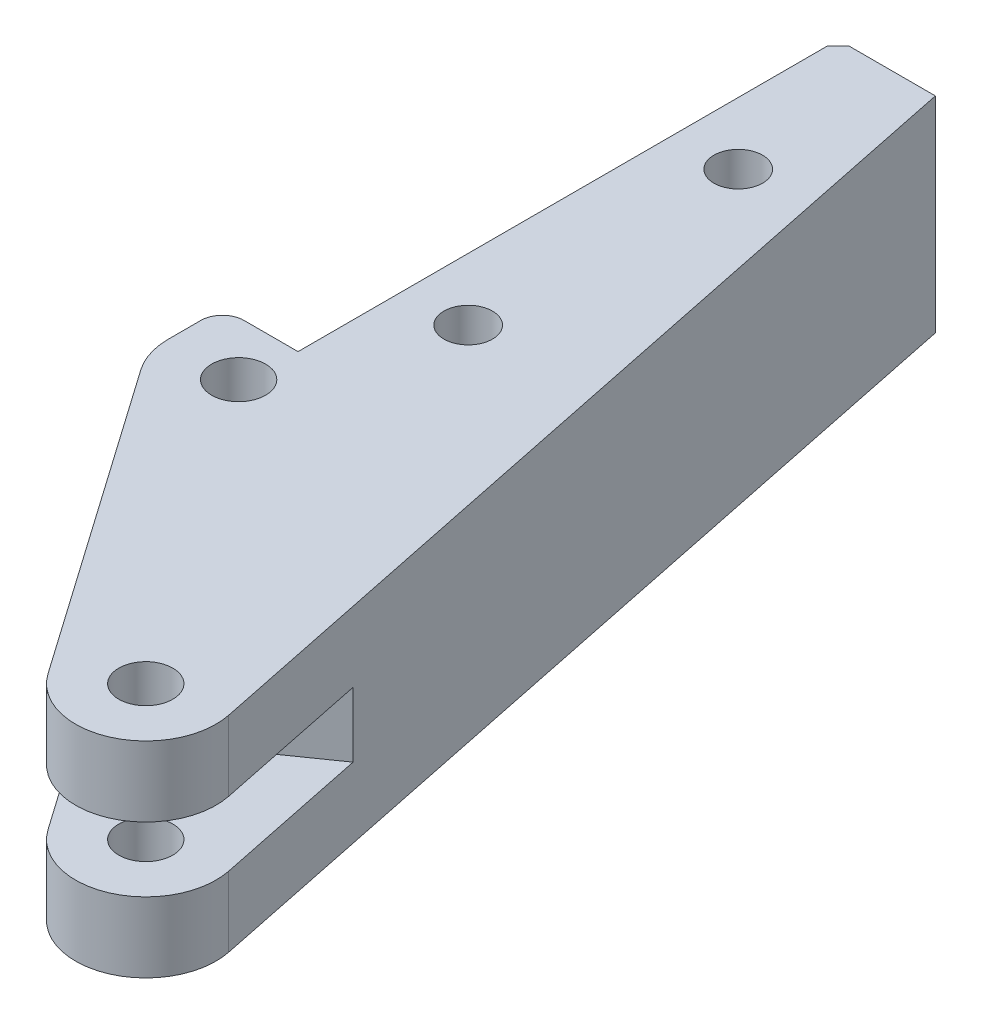
ISO-10303-21;
HEADER;
FILE_DESCRIPTION(('STEP AP214'),'2;1');
FILE_NAME('part.step','',(''),(''),'','','');
FILE_SCHEMA(('AUTOMOTIVE_DESIGN { 1 0 10303 214 1 1 1 1 }'));
ENDSEC;
DATA;
#1=APPLICATION_CONTEXT('core data for automotive mechanical design processes');
#2=APPLICATION_PROTOCOL_DEFINITION('international standard','automotive_design',2000,#1);
#3=PRODUCT_CONTEXT('',#1,'mechanical');
#4=PRODUCT('Part','Part','',(#3));
#5=PRODUCT_RELATED_PRODUCT_CATEGORY('part','',(#4));
#6=PRODUCT_DEFINITION_FORMATION('','',#4);
#7=PRODUCT_DEFINITION_CONTEXT('part definition',#1,'design');
#8=PRODUCT_DEFINITION('design','',#6,#7);
#9=PRODUCT_DEFINITION_SHAPE('','',#8);
#10=(LENGTH_UNIT() NAMED_UNIT(*) SI_UNIT(.MILLI.,.METRE.));
#11=(NAMED_UNIT(*) PLANE_ANGLE_UNIT() SI_UNIT($,.RADIAN.));
#12=(NAMED_UNIT(*) SI_UNIT($,.STERADIAN.) SOLID_ANGLE_UNIT());
#13=UNCERTAINTY_MEASURE_WITH_UNIT(LENGTH_MEASURE(1.E-05),#10,'distance_accuracy_value','');
#14=(GEOMETRIC_REPRESENTATION_CONTEXT(3) GLOBAL_UNCERTAINTY_ASSIGNED_CONTEXT((#13)) GLOBAL_UNIT_ASSIGNED_CONTEXT((#10,
#11,#12)) REPRESENTATION_CONTEXT('',''));
#15=CARTESIAN_POINT('',(0.,0.,0.));
#16=DIRECTION('',(0.,0.,1.));
#17=DIRECTION('',(1.,0.,0.));
#18=AXIS2_PLACEMENT_3D('',#15,#16,#17);
#19=CARTESIAN_POINT('',(41.6735620692423,-64.7405349652149,-38.4190588916441));
#20=DIRECTION('',(0.979491646613319,0.,-0.201484774151121));
#21=DIRECTION('',(-0.201484774151121,0.,-0.979491646613319));
#22=AXIS2_PLACEMENT_3D('',#19,#20,#21);
#23=PLANE('',#22);
#24=DIRECTION('',(0.,1.,0.));
#25=VECTOR('',#24,1.);
#26=CARTESIAN_POINT('',(58.6154330445155,-64.7405349652149,43.9416116264883));
#27=LINE('',#26,#25);
#28=CARTESIAN_POINT('',(58.6154330445155,32.5,43.9416116264883));
#29=VERTEX_POINT('',#28);
#30=CARTESIAN_POINT('',(58.6154330445155,39.,43.9416116264883));
#31=VERTEX_POINT('',#30);
#32=EDGE_CURVE('E164',#29,#31,#27,.T.);
#33=ORIENTED_EDGE('',*,*,#32,.F.);
#34=DIRECTION('',(0.201484774151123,0.,0.979491646613319));
#35=VECTOR('',#34,1.);
#36=CARTESIAN_POINT('',(55.6348248585961,32.5,29.4517781776063));
#37=LINE('',#36,#35);
#38=CARTESIAN_POINT('',(55.6348248585961,32.5,29.4517781776063));
#39=VERTEX_POINT('',#38);
#40=EDGE_CURVE('E145',#39,#29,#37,.T.);
#41=ORIENTED_EDGE('',*,*,#40,.F.);
#42=DIRECTION('',(0.,1.,0.));
#43=VECTOR('',#42,1.);
#44=CARTESIAN_POINT('',(55.6348248585961,-3.74195266303785,29.4517781776063));
#45=LINE('',#44,#43);
#46=CARTESIAN_POINT('',(55.6348248585961,26.5,29.4517781776063));
#47=VERTEX_POINT('',#46);
#48=EDGE_CURVE('E155',#47,#39,#45,.T.);
#49=ORIENTED_EDGE('',*,*,#48,.F.);
#50=DIRECTION('',(-0.201484774151123,0.,-0.979491646613319));
#51=VECTOR('',#50,1.);
#52=CARTESIAN_POINT('',(55.6348248585961,26.5,29.4517781776063));
#53=LINE('',#52,#51);
#54=CARTESIAN_POINT('',(58.6154330445155,26.5,43.9416116264883));
#55=VERTEX_POINT('',#54);
#56=EDGE_CURVE('E161',#55,#47,#53,.T.);
#57=ORIENTED_EDGE('',*,*,#56,.F.);
#58=CARTESIAN_POINT('',(58.6154330445155,20.,43.9416116264883));
#59=VERTEX_POINT('',#58);
#60=EDGE_CURVE('E183',#59,#55,#27,.T.);
#61=ORIENTED_EDGE('',*,*,#60,.F.);
#62=DIRECTION('',(0.201484774151121,0.,0.979491646613319));
#63=VECTOR('',#62,1.);
#64=CARTESIAN_POINT('',(41.6735620692423,20.,-38.4190588916441));
#65=LINE('',#64,#63);
#66=CARTESIAN_POINT('',(41.6735620692423,20.,-38.4190588916441));
#67=VERTEX_POINT('',#66);
#68=EDGE_CURVE('E174',#67,#59,#65,.T.);
#69=ORIENTED_EDGE('',*,*,#68,.F.);
#70=DIRECTION('',(0.,1.,0.));
#71=VECTOR('',#70,1.);
#72=CARTESIAN_POINT('',(41.6735620692423,-64.7405349652149,-38.4190588916441));
#73=LINE('',#72,#71);
#74=CARTESIAN_POINT('',(41.6735620692423,39.,-38.4190588916441));
#75=VERTEX_POINT('',#74);
#76=EDGE_CURVE('E177',#67,#75,#73,.T.);
#77=ORIENTED_EDGE('',*,*,#76,.T.);
#78=DIRECTION('',(-0.201484774151121,0.,-0.979491646613319));
#79=VECTOR('',#78,1.);
#80=CARTESIAN_POINT('',(41.6735620692423,39.,-38.4190588916441));
#81=LINE('',#80,#79);
#82=EDGE_CURVE('E178',#31,#75,#81,.T.);
#83=ORIENTED_EDGE('',*,*,#82,.F.);
#84=EDGE_LOOP('',(#33,#41,#49,#57,#61,#69,#77,#83));
#85=FACE_BOUND('',#84,.T.);
#86=ADVANCED_FACE('F35',(#85),#23,.T.);
#87=CARTESIAN_POINT('',(46.9242490536505,39.,48.9795094947524));
#88=DIRECTION('',(0.819152044288991,0.,-0.573576436351048));
#89=DIRECTION('',(-0.573576436351048,0.,-0.819152044288991));
#90=AXIS2_PLACEMENT_3D('',#87,#88,#89);
#91=PLANE('',#90);
#92=DIRECTION('',(0.,1.,0.));
#93=VECTOR('',#92,1.);
#94=CARTESIAN_POINT('',(38.3206025083848,39.,36.6922288304175));
#95=LINE('',#94,#93);
#96=CARTESIAN_POINT('',(38.3206025083848,26.5,36.6922288304175));
#97=VERTEX_POINT('',#96);
#98=CARTESIAN_POINT('',(38.3206025083848,32.5,36.6922288304175));
#99=VERTEX_POINT('',#98);
#100=EDGE_CURVE('E254',#97,#99,#95,.T.);
#101=ORIENTED_EDGE('',*,*,#100,.T.);
#102=DIRECTION('',(0.573576436351049,0.,0.81915204428899));
#103=VECTOR('',#102,1.);
#104=CARTESIAN_POINT('',(40.614908253789,32.5,39.9688370075735));
#105=LINE('',#104,#103);
#106=CARTESIAN_POINT('',(46.9242490536505,32.5,48.9795094947524));
#107=VERTEX_POINT('',#106);
#108=EDGE_CURVE('E151',#99,#107,#105,.T.);
#109=ORIENTED_EDGE('',*,*,#108,.T.);
#110=DIRECTION('',(0.,-1.,0.));
#111=VECTOR('',#110,1.);
#112=CARTESIAN_POINT('',(46.9242490536505,39.,48.9795094947524));
#113=LINE('',#112,#111);
#114=CARTESIAN_POINT('',(46.9242490536505,39.,48.9795094947524));
#115=VERTEX_POINT('',#114);
#116=EDGE_CURVE('E245',#115,#107,#113,.T.);
#117=ORIENTED_EDGE('',*,*,#116,.F.);
#118=DIRECTION('',(0.573576436351048,0.,0.819152044288991));
#119=VECTOR('',#118,1.);
#120=CARTESIAN_POINT('',(46.9242490536505,39.,48.9795094947524));
#121=LINE('',#120,#119);
#122=CARTESIAN_POINT('',(26.8490737813639,39.,20.3091879446377));
#123=VERTEX_POINT('',#122);
#124=EDGE_CURVE('E228',#123,#115,#121,.T.);
#125=ORIENTED_EDGE('',*,*,#124,.F.);
#126=DIRECTION('',(0.,-1.,0.));
#127=VECTOR('',#126,1.);
#128=CARTESIAN_POINT('',(26.8490737813639,39.,20.3091879446377));
#129=LINE('',#128,#127);
#130=CARTESIAN_POINT('',(26.8490737813639,20.,20.3091879446377));
#131=VERTEX_POINT('',#130);
#132=EDGE_CURVE('E248',#123,#131,#129,.T.);
#133=ORIENTED_EDGE('',*,*,#132,.T.);
#134=DIRECTION('',(0.573576436351048,0.,0.819152044288991));
#135=VECTOR('',#134,1.);
#136=CARTESIAN_POINT('',(46.9242490536505,20.,48.9795094947524));
#137=LINE('',#136,#135);
#138=CARTESIAN_POINT('',(46.9242490536505,20.,48.9795094947524));
#139=VERTEX_POINT('',#138);
#140=EDGE_CURVE('E240',#131,#139,#137,.T.);
#141=ORIENTED_EDGE('',*,*,#140,.T.);
#142=CARTESIAN_POINT('',(46.9242490536505,26.5,48.9795094947524));
#143=VERTEX_POINT('',#142);
#144=EDGE_CURVE('E233',#143,#139,#113,.T.);
#145=ORIENTED_EDGE('',*,*,#144,.F.);
#146=DIRECTION('',(0.573576436351049,0.,0.81915204428899));
#147=VECTOR('',#146,1.);
#148=CARTESIAN_POINT('',(40.614908253789,26.5,39.9688370075735));
#149=LINE('',#148,#147);
#150=EDGE_CURVE('E201',#97,#143,#149,.T.);
#151=ORIENTED_EDGE('',*,*,#150,.F.);
#152=EDGE_LOOP('',(#101,#109,#117,#125,#133,#141,#145,#151));
#153=FACE_BOUND('',#152,.T.);
#154=ADVANCED_FACE('F293',(#153),#91,.F.);
#155=CARTESIAN_POINT('',(52.248737341529,39.,45.2512626584706));
#156=DIRECTION('',(0.,-1.,0.));
#157=DIRECTION('',(0.,0.,-1.));
#158=AXIS2_PLACEMENT_3D('',#155,#156,#157);
#159=CYLINDRICAL_SURFACE('',#158,6.50000000000001);
#160=CARTESIAN_POINT('',(52.248737341529,20.,45.2512626584706));
#161=DIRECTION('',(0.,1.,0.));
#162=DIRECTION('',(0.,0.,1.));
#163=AXIS2_PLACEMENT_3D('',#160,#161,#162);
#164=CIRCLE('',#163,6.50000000000001);
#165=EDGE_CURVE('E224',#139,#59,#164,.T.);
#166=ORIENTED_EDGE('',*,*,#165,.T.);
#167=ORIENTED_EDGE('',*,*,#60,.T.);
#168=CARTESIAN_POINT('',(52.248737341529,26.5,45.2512626584706));
#169=DIRECTION('',(0.,1.,0.));
#170=DIRECTION('',(0.,0.,1.));
#171=AXIS2_PLACEMENT_3D('',#168,#169,#170);
#172=CIRCLE('',#171,6.5);
#173=EDGE_CURVE('E197',#143,#55,#172,.T.);
#174=ORIENTED_EDGE('',*,*,#173,.F.);
#175=ORIENTED_EDGE('',*,*,#144,.T.);
#176=EDGE_LOOP('',(#166,#167,#174,#175));
#177=FACE_BOUND('',#176,.T.);
#178=ADVANCED_FACE('F306',(#177),#159,.T.);
#179=CARTESIAN_POINT('',(52.248737341529,20.,45.2512626584706));
#180=DIRECTION('',(0.,1.,0.));
#181=DIRECTION('',(0.,0.,1.));
#182=AXIS2_PLACEMENT_3D('',#179,#180,#181);
#183=CYLINDRICAL_SURFACE('',#182,2.5);
#184=CARTESIAN_POINT('',(52.248737341529,20.,45.2512626584706));
#185=DIRECTION('',(0.,1.,0.));
#186=DIRECTION('',(0.,0.,1.));
#187=AXIS2_PLACEMENT_3D('',#184,#185,#186);
#188=CIRCLE('',#187,2.5);
#189=CARTESIAN_POINT('',(52.248737341529,20.,47.7512626584706));
#190=VERTEX_POINT('',#189);
#191=EDGE_CURVE('E207',#190,#190,#188,.T.);
#192=ORIENTED_EDGE('',*,*,#191,.F.);
#193=EDGE_LOOP('',(#192));
#194=FACE_BOUND('',#193,.T.);
#195=CARTESIAN_POINT('',(52.248737341529,26.5,45.2512626584706));
#196=DIRECTION('',(0.,1.,0.));
#197=DIRECTION('',(0.,0.,1.));
#198=AXIS2_PLACEMENT_3D('',#195,#196,#197);
#199=CIRCLE('',#198,2.5);
#200=CARTESIAN_POINT('',(52.248737341529,26.5,47.7512626584706));
#201=VERTEX_POINT('',#200);
#202=EDGE_CURVE('E214',#201,#201,#199,.F.);
#203=ORIENTED_EDGE('',*,*,#202,.F.);
#204=EDGE_LOOP('',(#203));
#205=FACE_BOUND('',#204,.T.);
#206=ADVANCED_FACE('F351',(#194,#205),#183,.F.);
#207=CARTESIAN_POINT('',(38.6735620692423,39.,-38.4190588916441));
#208=DIRECTION('',(0.,0.,1.));
#209=DIRECTION('',(1.,0.,0.));
#210=AXIS2_PLACEMENT_3D('',#207,#208,#209);
#211=PLANE('',#210);
#212=DIRECTION('',(-1.,0.,0.));
#213=VECTOR('',#212,1.);
#214=CARTESIAN_POINT('',(38.6735620692423,20.,-38.4190588916441));
#215=LINE('',#214,#213);
#216=CARTESIAN_POINT('',(33.6735620692423,20.,-38.4190588916441));
#217=VERTEX_POINT('',#216);
#218=EDGE_CURVE('E218',#67,#217,#215,.T.);
#219=ORIENTED_EDGE('',*,*,#218,.T.);
#220=DIRECTION('',(0.,1.,0.));
#221=VECTOR('',#220,1.);
#222=CARTESIAN_POINT('',(33.6735620692423,39.,-38.4190588916441));
#223=LINE('',#222,#221);
#224=CARTESIAN_POINT('',(33.6735620692423,39.,-38.4190588916441));
#225=VERTEX_POINT('',#224);
#226=EDGE_CURVE('E276',#217,#225,#223,.T.);
#227=ORIENTED_EDGE('',*,*,#226,.T.);
#228=DIRECTION('',(-1.,0.,0.));
#229=VECTOR('',#228,1.);
#230=CARTESIAN_POINT('',(38.6735620692423,39.,-38.4190588916441));
#231=LINE('',#230,#229);
#232=EDGE_CURVE('E221',#75,#225,#231,.T.);
#233=ORIENTED_EDGE('',*,*,#232,.F.);
#234=ORIENTED_EDGE('',*,*,#76,.F.);
#235=EDGE_LOOP('',(#219,#227,#233,#234));
#236=FACE_BOUND('',#235,.T.);
#237=ADVANCED_FACE('F281',(#236),#211,.F.);
#238=CARTESIAN_POINT('',(25.6735620692423,39.,-38.4190588916441));
#239=DIRECTION('',(1.,0.,0.));
#240=DIRECTION('',(0.,0.,-1.));
#241=AXIS2_PLACEMENT_3D('',#238,#239,#240);
#242=PLANE('',#241);
#243=DIRECTION('',(0.,0.,1.));
#244=VECTOR('',#243,1.);
#245=CARTESIAN_POINT('',(25.6735620692423,39.,-38.4190588916441));
#246=LINE('',#245,#244);
#247=CARTESIAN_POINT('',(25.6735620692423,39.,13.5809411083559));
#248=VERTEX_POINT('',#247);
#249=CARTESIAN_POINT('',(25.6735620692423,39.,16.5809411083559));
#250=VERTEX_POINT('',#249);
#251=EDGE_CURVE('E223',#248,#250,#246,.T.);
#252=ORIENTED_EDGE('',*,*,#251,.F.);
#253=DIRECTION('',(0.,1.,0.));
#254=VECTOR('',#253,1.);
#255=CARTESIAN_POINT('',(25.6735620692423,39.,13.5809411083559));
#256=LINE('',#255,#254);
#257=CARTESIAN_POINT('',(25.6735620692423,20.,13.5809411083559));
#258=VERTEX_POINT('',#257);
#259=EDGE_CURVE('E272',#248,#258,#256,.F.);
#260=ORIENTED_EDGE('',*,*,#259,.T.);
#261=DIRECTION('',(0.,0.,1.));
#262=VECTOR('',#261,1.);
#263=CARTESIAN_POINT('',(25.6735620692423,20.,-38.4190588916441));
#264=LINE('',#263,#262);
#265=CARTESIAN_POINT('',(25.6735620692423,20.,16.5809411083559));
#266=VERTEX_POINT('',#265);
#267=EDGE_CURVE('E236',#258,#266,#264,.T.);
#268=ORIENTED_EDGE('',*,*,#267,.T.);
#269=DIRECTION('',(0.,-1.,0.));
#270=VECTOR('',#269,1.);
#271=CARTESIAN_POINT('',(25.6735620692423,39.,16.5809411083559));
#272=LINE('',#271,#270);
#273=EDGE_CURVE('E251',#250,#266,#272,.T.);
#274=ORIENTED_EDGE('',*,*,#273,.F.);
#275=EDGE_LOOP('',(#252,#260,#268,#274));
#276=FACE_BOUND('',#275,.T.);
#277=ADVANCED_FACE('F366',(#276),#242,.F.);
#278=CARTESIAN_POINT('',(32.1735620692423,39.,16.5809411083559));
#279=DIRECTION('',(0.,-1.,0.));
#280=DIRECTION('',(0.,0.,-1.));
#281=AXIS2_PLACEMENT_3D('',#278,#279,#280);
#282=CYLINDRICAL_SURFACE('',#281,6.50000000000001);
#283=CARTESIAN_POINT('',(32.1735620692423,20.,16.5809411083559));
#284=DIRECTION('',(0.,1.,0.));
#285=DIRECTION('',(0.,0.,1.));
#286=AXIS2_PLACEMENT_3D('',#283,#284,#285);
#287=CIRCLE('',#286,6.50000000000001);
#288=EDGE_CURVE('E238',#266,#131,#287,.T.);
#289=ORIENTED_EDGE('',*,*,#288,.T.);
#290=ORIENTED_EDGE('',*,*,#132,.F.);
#291=CARTESIAN_POINT('',(32.1735620692423,39.,16.5809411083559));
#292=DIRECTION('',(0.,1.,0.));
#293=DIRECTION('',(0.,0.,1.));
#294=AXIS2_PLACEMENT_3D('',#291,#292,#293);
#295=CIRCLE('',#294,6.50000000000001);
#296=EDGE_CURVE('E226',#250,#123,#295,.T.);
#297=ORIENTED_EDGE('',*,*,#296,.F.);
#298=ORIENTED_EDGE('',*,*,#273,.T.);
#299=EDGE_LOOP('',(#289,#290,#297,#298));
#300=FACE_BOUND('',#299,.T.);
#301=ADVANCED_FACE('F362',(#300),#282,.T.);
#302=CARTESIAN_POINT('',(52.248737341529,32.5,45.2512626584706));
#303=DIRECTION('',(0.,1.,0.));
#304=DIRECTION('',(0.,0.,1.));
#305=AXIS2_PLACEMENT_3D('',#302,#303,#304);
#306=CIRCLE('',#305,6.5);
#307=EDGE_CURVE('E152',#107,#29,#306,.T.);
#308=ORIENTED_EDGE('',*,*,#307,.T.);
#309=ORIENTED_EDGE('',*,*,#32,.T.);
#310=CARTESIAN_POINT('',(52.248737341529,39.,45.2512626584706));
#311=DIRECTION('',(0.,1.,0.));
#312=DIRECTION('',(0.,0.,1.));
#313=AXIS2_PLACEMENT_3D('',#310,#311,#312);
#314=CIRCLE('',#313,6.50000000000001);
#315=EDGE_CURVE('E230',#115,#31,#314,.T.);
#316=ORIENTED_EDGE('',*,*,#315,.F.);
#317=ORIENTED_EDGE('',*,*,#116,.T.);
#318=EDGE_LOOP('',(#308,#309,#316,#317));
#319=FACE_BOUND('',#318,.T.);
#320=ADVANCED_FACE('F290',(#319),#159,.T.);
#321=CARTESIAN_POINT('',(32.1735620692423,39.,16.5809411083559));
#322=DIRECTION('',(0.,1.,0.));
#323=DIRECTION('',(0.,0.,1.));
#324=AXIS2_PLACEMENT_3D('',#321,#322,#323);
#325=PLANE('',#324);
#326=CARTESIAN_POINT('',(38.4235620692423,39.,1.58094110835589));
#327=DIRECTION('',(0.,1.,0.));
#328=DIRECTION('',(0.,0.,1.));
#329=AXIS2_PLACEMENT_3D('',#326,#327,#328);
#330=CIRCLE('',#329,2.25);
#331=CARTESIAN_POINT('',(38.4235620692423,39.,3.8309411083559));
#332=VERTEX_POINT('',#331);
#333=EDGE_CURVE('E539',#332,#332,#330,.T.);
#334=ORIENTED_EDGE('',*,*,#333,.F.);
#335=EDGE_LOOP('',(#334));
#336=FACE_BOUND('',#335,.T.);
#337=CARTESIAN_POINT('',(38.4235620692423,39.,-23.4190588916441));
#338=DIRECTION('',(0.,1.,0.));
#339=DIRECTION('',(0.,0.,1.));
#340=AXIS2_PLACEMENT_3D('',#337,#338,#339);
#341=CIRCLE('',#340,2.25);
#342=CARTESIAN_POINT('',(38.4235620692423,39.,-21.1690588916441));
#343=VERTEX_POINT('',#342);
#344=EDGE_CURVE('E169',#343,#343,#341,.T.);
#345=ORIENTED_EDGE('',*,*,#344,.F.);
#346=EDGE_LOOP('',(#345));
#347=FACE_BOUND('',#346,.T.);
#348=ORIENTED_EDGE('',*,*,#232,.T.);
#349=DIRECTION('',(0.707106781186543,0.,-0.707106781186552));
#350=VECTOR('',#349,1.);
#351=CARTESIAN_POINT('',(5.42356206924232,39.,-10.1690588916437));
#352=LINE('',#351,#350);
#353=CARTESIAN_POINT('',(32.6735620692423,39.,-37.4190588916441));
#354=VERTEX_POINT('',#353);
#355=EDGE_CURVE('E57',#225,#354,#352,.F.);
#356=ORIENTED_EDGE('',*,*,#355,.T.);
#357=DIRECTION('',(0.,0.,-1.));
#358=VECTOR('',#357,1.);
#359=CARTESIAN_POINT('',(32.6735620692423,39.,-38.4190588916441));
#360=LINE('',#359,#358);
#361=CARTESIAN_POINT('',(32.6735620692423,39.,11.5809411083559));
#362=VERTEX_POINT('',#361);
#363=EDGE_CURVE('E191',#362,#354,#360,.T.);
#364=ORIENTED_EDGE('',*,*,#363,.F.);
#365=DIRECTION('',(1.,0.,0.));
#366=VECTOR('',#365,1.);
#367=CARTESIAN_POINT('',(25.6735620692423,39.,11.5809411083559));
#368=LINE('',#367,#366);
#369=CARTESIAN_POINT('',(27.6735620692423,39.,11.5809411083559));
#370=VERTEX_POINT('',#369);
#371=EDGE_CURVE('E176',#370,#362,#368,.T.);
#372=ORIENTED_EDGE('',*,*,#371,.F.);
#373=CARTESIAN_POINT('',(27.6735620692423,39.,13.5809411083559));
#374=DIRECTION('',(0.,1.,0.));
#375=DIRECTION('',(0.,0.,1.));
#376=AXIS2_PLACEMENT_3D('',#373,#374,#375);
#377=CIRCLE('',#376,2.);
#378=EDGE_CURVE('E270',#370,#248,#377,.T.);
#379=ORIENTED_EDGE('',*,*,#378,.T.);
#380=ORIENTED_EDGE('',*,*,#251,.T.);
#381=ORIENTED_EDGE('',*,*,#296,.T.);
#382=ORIENTED_EDGE('',*,*,#124,.T.);
#383=ORIENTED_EDGE('',*,*,#315,.T.);
#384=ORIENTED_EDGE('',*,*,#82,.T.);
#385=EDGE_LOOP('',(#348,#356,#364,#372,#379,#380,#381,#382,#383,#384));
#386=FACE_BOUND('',#385,.T.);
#387=CARTESIAN_POINT('',(52.248737341529,39.,45.2512626584706));
#388=DIRECTION('',(0.,1.,0.));
#389=DIRECTION('',(0.,0.,1.));
#390=AXIS2_PLACEMENT_3D('',#387,#388,#389);
#391=CIRCLE('',#390,2.5);
#392=CARTESIAN_POINT('',(52.248737341529,39.,47.7512626584706));
#393=VERTEX_POINT('',#392);
#394=EDGE_CURVE('E211',#393,#393,#391,.T.);
#395=ORIENTED_EDGE('',*,*,#394,.F.);
#396=EDGE_LOOP('',(#395));
#397=FACE_BOUND('',#396,.T.);
#398=CARTESIAN_POINT('',(32.1735620692423,39.,16.5809411083559));
#399=DIRECTION('',(0.,1.,0.));
#400=DIRECTION('',(0.,0.,1.));
#401=AXIS2_PLACEMENT_3D('',#398,#399,#400);
#402=CIRCLE('',#401,2.50000000000002);
#403=CARTESIAN_POINT('',(32.1735620692423,39.,19.0809411083559));
#404=VERTEX_POINT('',#403);
#405=EDGE_CURVE('E210',#404,#404,#402,.T.);
#406=ORIENTED_EDGE('',*,*,#405,.F.);
#407=EDGE_LOOP('',(#406));
#408=FACE_BOUND('',#407,.T.);
#409=ADVANCED_FACE('F285',(#336,#347,#386,#397,#408),#325,.T.);
#410=CARTESIAN_POINT('',(32.1735620692423,20.,16.5809411083559));
#411=DIRECTION('',(0.,1.,0.));
#412=DIRECTION('',(0.,0.,1.));
#413=AXIS2_PLACEMENT_3D('',#410,#411,#412);
#414=PLANE('',#413);
#415=CARTESIAN_POINT('',(38.4235620692423,20.,1.58094110835589));
#416=DIRECTION('',(0.,1.,0.));
#417=DIRECTION('',(0.,0.,1.));
#418=AXIS2_PLACEMENT_3D('',#415,#416,#417);
#419=CIRCLE('',#418,2.25);
#420=CARTESIAN_POINT('',(38.4235620692423,20.,3.8309411083559));
#421=VERTEX_POINT('',#420);
#422=EDGE_CURVE('E536',#421,#421,#419,.T.);
#423=ORIENTED_EDGE('',*,*,#422,.T.);
#424=EDGE_LOOP('',(#423));
#425=FACE_BOUND('',#424,.T.);
#426=CARTESIAN_POINT('',(38.4235620692423,20.,-23.4190588916441));
#427=DIRECTION('',(0.,1.,0.));
#428=DIRECTION('',(0.,0.,1.));
#429=AXIS2_PLACEMENT_3D('',#426,#427,#428);
#430=CIRCLE('',#429,2.25);
#431=CARTESIAN_POINT('',(38.4235620692423,20.,-21.1690588916441));
#432=VERTEX_POINT('',#431);
#433=EDGE_CURVE('E166',#432,#432,#430,.T.);
#434=ORIENTED_EDGE('',*,*,#433,.T.);
#435=EDGE_LOOP('',(#434));
#436=FACE_BOUND('',#435,.T.);
#437=DIRECTION('',(0.,0.,1.));
#438=VECTOR('',#437,1.);
#439=CARTESIAN_POINT('',(32.6735620692423,20.,-38.4190588916441));
#440=LINE('',#439,#438);
#441=CARTESIAN_POINT('',(32.6735620692423,20.,-37.4190588916441));
#442=VERTEX_POINT('',#441);
#443=CARTESIAN_POINT('',(32.6735620692423,20.,11.5809411083559));
#444=VERTEX_POINT('',#443);
#445=EDGE_CURVE('E186',#442,#444,#440,.T.);
#446=ORIENTED_EDGE('',*,*,#445,.F.);
#447=DIRECTION('',(-0.707106781186543,0.,0.707106781186552));
#448=VECTOR('',#447,1.);
#449=CARTESIAN_POINT('',(33.6735620692423,20.,-38.4190588916441));
#450=LINE('',#449,#448);
#451=EDGE_CURVE('E11',#442,#217,#450,.F.);
#452=ORIENTED_EDGE('',*,*,#451,.T.);
#453=ORIENTED_EDGE('',*,*,#218,.F.);
#454=ORIENTED_EDGE('',*,*,#68,.T.);
#455=ORIENTED_EDGE('',*,*,#165,.F.);
#456=ORIENTED_EDGE('',*,*,#140,.F.);
#457=ORIENTED_EDGE('',*,*,#288,.F.);
#458=ORIENTED_EDGE('',*,*,#267,.F.);
#459=CARTESIAN_POINT('',(27.6735620692423,20.,13.5809411083559));
#460=DIRECTION('',(0.,1.,0.));
#461=DIRECTION('',(0.,0.,1.));
#462=AXIS2_PLACEMENT_3D('',#459,#460,#461);
#463=CIRCLE('',#462,2.);
#464=CARTESIAN_POINT('',(27.6735620692423,20.,11.5809411083559));
#465=VERTEX_POINT('',#464);
#466=EDGE_CURVE('E274',#258,#465,#463,.F.);
#467=ORIENTED_EDGE('',*,*,#466,.T.);
#468=DIRECTION('',(-1.,0.,0.));
#469=VECTOR('',#468,1.);
#470=CARTESIAN_POINT('',(25.6735620692423,20.,11.5809411083559));
#471=LINE('',#470,#469);
#472=EDGE_CURVE('E188',#444,#465,#471,.T.);
#473=ORIENTED_EDGE('',*,*,#472,.F.);
#474=EDGE_LOOP('',(#446,#452,#453,#454,#455,#456,#457,#458,#467,#473));
#475=FACE_BOUND('',#474,.T.);
#476=ORIENTED_EDGE('',*,*,#191,.T.);
#477=EDGE_LOOP('',(#476));
#478=FACE_BOUND('',#477,.T.);
#479=CARTESIAN_POINT('',(32.1735620692423,20.,16.5809411083559));
#480=DIRECTION('',(0.,1.,0.));
#481=DIRECTION('',(0.,0.,1.));
#482=AXIS2_PLACEMENT_3D('',#479,#480,#481);
#483=CIRCLE('',#482,2.50000000000002);
#484=CARTESIAN_POINT('',(32.1735620692423,20.,19.0809411083559));
#485=VERTEX_POINT('',#484);
#486=EDGE_CURVE('E215',#485,#485,#483,.T.);
#487=ORIENTED_EDGE('',*,*,#486,.T.);
#488=EDGE_LOOP('',(#487));
#489=FACE_BOUND('',#488,.T.);
#490=ADVANCED_FACE('F310',(#425,#436,#475,#478,#489),#414,.F.);
#491=CARTESIAN_POINT('',(32.1735620692423,20.,16.5809411083559));
#492=DIRECTION('',(0.,1.,0.));
#493=DIRECTION('',(0.,0.,1.));
#494=AXIS2_PLACEMENT_3D('',#491,#492,#493);
#495=CYLINDRICAL_SURFACE('',#494,2.50000000000002);
#496=ORIENTED_EDGE('',*,*,#486,.F.);
#497=EDGE_LOOP('',(#496));
#498=FACE_BOUND('',#497,.T.);
#499=ORIENTED_EDGE('',*,*,#405,.T.);
#500=EDGE_LOOP('',(#499));
#501=FACE_BOUND('',#500,.T.);
#502=ADVANCED_FACE('F349',(#498,#501),#495,.F.);
#503=CARTESIAN_POINT('',(52.248737341529,32.5,45.2512626584706));
#504=DIRECTION('',(0.,1.,0.));
#505=DIRECTION('',(0.,0.,1.));
#506=AXIS2_PLACEMENT_3D('',#503,#504,#505);
#507=CIRCLE('',#506,2.5);
#508=CARTESIAN_POINT('',(52.248737341529,32.5,47.7512626584706));
#509=VERTEX_POINT('',#508);
#510=EDGE_CURVE('E203',#509,#509,#507,.F.);
#511=ORIENTED_EDGE('',*,*,#510,.T.);
#512=EDGE_LOOP('',(#511));
#513=FACE_BOUND('',#512,.T.);
#514=ORIENTED_EDGE('',*,*,#394,.T.);
#515=EDGE_LOOP('',(#514));
#516=FACE_BOUND('',#515,.T.);
#517=ADVANCED_FACE('F342',(#513,#516),#183,.F.);
#518=CARTESIAN_POINT('',(52.248737341529,26.5,45.2512626584706));
#519=DIRECTION('',(0.,1.,0.));
#520=DIRECTION('',(0.,0.,1.));
#521=AXIS2_PLACEMENT_3D('',#518,#519,#520);
#522=PLANE('',#521);
#523=ORIENTED_EDGE('',*,*,#173,.T.);
#524=ORIENTED_EDGE('',*,*,#56,.T.);
#525=DIRECTION('',(-0.819152044288991,0.,0.573576436351048));
#526=VECTOR('',#525,1.);
#527=CARTESIAN_POINT('',(51.2638848295459,26.5,32.5123433350099));
#528=LINE('',#527,#526);
#529=CARTESIAN_POINT('',(43.891516430945,26.5,37.6745312621693));
#530=VERTEX_POINT('',#529);
#531=EDGE_CURVE('E158',#47,#530,#528,.T.);
#532=ORIENTED_EDGE('',*,*,#531,.T.);
#533=DIRECTION('',(0.984807753012209,0.,0.173648177666928));
#534=VECTOR('',#533,1.);
#535=CARTESIAN_POINT('',(38.3206025083848,26.5,36.6922288304175));
#536=LINE('',#535,#534);
#537=EDGE_CURVE('E264',#530,#97,#536,.F.);
#538=ORIENTED_EDGE('',*,*,#537,.T.);
#539=ORIENTED_EDGE('',*,*,#150,.T.);
#540=EDGE_LOOP('',(#523,#524,#532,#538,#539));
#541=FACE_BOUND('',#540,.T.);
#542=ORIENTED_EDGE('',*,*,#202,.T.);
#543=EDGE_LOOP('',(#542));
#544=FACE_BOUND('',#543,.T.);
#545=ADVANCED_FACE('F301',(#541,#544),#522,.T.);
#546=CARTESIAN_POINT('',(52.248737341529,32.5,45.2512626584706));
#547=DIRECTION('',(0.,1.,0.));
#548=DIRECTION('',(0.,0.,1.));
#549=AXIS2_PLACEMENT_3D('',#546,#547,#548);
#550=PLANE('',#549);
#551=ORIENTED_EDGE('',*,*,#40,.T.);
#552=ORIENTED_EDGE('',*,*,#307,.F.);
#553=ORIENTED_EDGE('',*,*,#108,.F.);
#554=DIRECTION('',(-0.984807753012209,0.,-0.173648177666928));
#555=VECTOR('',#554,1.);
#556=CARTESIAN_POINT('',(53.2924336752652,32.5,39.3321666157504));
#557=LINE('',#556,#555);
#558=CARTESIAN_POINT('',(43.891516430945,32.5,37.6745312621693));
#559=VERTEX_POINT('',#558);
#560=EDGE_CURVE('E148',#99,#559,#557,.F.);
#561=ORIENTED_EDGE('',*,*,#560,.T.);
#562=DIRECTION('',(-0.819152044288991,0.,0.573576436351048));
#563=VECTOR('',#562,1.);
#564=CARTESIAN_POINT('',(51.2638848295459,32.5,32.5123433350099));
#565=LINE('',#564,#563);
#566=EDGE_CURVE('E140',#39,#559,#565,.T.);
#567=ORIENTED_EDGE('',*,*,#566,.F.);
#568=EDGE_LOOP('',(#551,#552,#553,#561,#567));
#569=FACE_BOUND('',#568,.T.);
#570=ORIENTED_EDGE('',*,*,#510,.F.);
#571=EDGE_LOOP('',(#570));
#572=FACE_BOUND('',#571,.T.);
#573=ADVANCED_FACE('F142',(#569,#572),#550,.F.);
#574=CARTESIAN_POINT('',(51.2638848295459,26.5,32.5123433350099));
#575=DIRECTION('',(-0.573576436351048,0.,-0.819152044288991));
#576=DIRECTION('',(-0.819152044288991,0.,0.573576436351048));
#577=AXIS2_PLACEMENT_3D('',#574,#575,#576);
#578=PLANE('',#577);
#579=ORIENTED_EDGE('',*,*,#566,.T.);
#580=DIRECTION('',(0.,-1.,0.));
#581=VECTOR('',#580,1.);
#582=CARTESIAN_POINT('',(43.891516430945,26.5,37.6745312621693));
#583=LINE('',#582,#581);
#584=EDGE_CURVE('E261',#559,#530,#583,.T.);
#585=ORIENTED_EDGE('',*,*,#584,.T.);
#586=ORIENTED_EDGE('',*,*,#531,.F.);
#587=ORIENTED_EDGE('',*,*,#48,.T.);
#588=EDGE_LOOP('',(#579,#585,#586,#587));
#589=FACE_BOUND('',#588,.T.);
#590=ADVANCED_FACE('F156',(#589),#578,.F.);
#591=CARTESIAN_POINT('',(38.3206025083848,39.,36.6922288304175));
#592=DIRECTION('',(0.173648177666928,0.,-0.984807753012208));
#593=DIRECTION('',(0.,1.,0.));
#594=AXIS2_PLACEMENT_3D('',#591,#592,#593);
#595=PLANE('',#594);
#596=ORIENTED_EDGE('',*,*,#537,.F.);
#597=ORIENTED_EDGE('',*,*,#584,.F.);
#598=ORIENTED_EDGE('',*,*,#560,.F.);
#599=ORIENTED_EDGE('',*,*,#100,.F.);
#600=EDGE_LOOP('',(#596,#597,#598,#599));
#601=FACE_BOUND('',#600,.T.);
#602=ADVANCED_FACE('F299',(#601),#595,.F.);
#603=CARTESIAN_POINT('',(32.6735620692423,-30.4876222454574,-38.4190588916441));
#604=DIRECTION('',(1.,0.,0.));
#605=DIRECTION('',(0.,0.,-1.));
#606=AXIS2_PLACEMENT_3D('',#603,#604,#605);
#607=PLANE('',#606);
#608=ORIENTED_EDGE('',*,*,#363,.T.);
#609=DIRECTION('',(0.,-1.,0.));
#610=VECTOR('',#609,1.);
#611=CARTESIAN_POINT('',(32.6735620692423,-30.4876222454574,-37.4190588916441));
#612=LINE('',#611,#610);
#613=EDGE_CURVE('E43',#354,#442,#612,.T.);
#614=ORIENTED_EDGE('',*,*,#613,.T.);
#615=ORIENTED_EDGE('',*,*,#445,.T.);
#616=DIRECTION('',(0.,1.,0.));
#617=VECTOR('',#616,1.);
#618=CARTESIAN_POINT('',(32.6735620692423,-30.4876222454574,11.5809411083559));
#619=LINE('',#618,#617);
#620=EDGE_CURVE('E189',#444,#362,#619,.T.);
#621=ORIENTED_EDGE('',*,*,#620,.T.);
#622=EDGE_LOOP('',(#608,#614,#615,#621));
#623=FACE_BOUND('',#622,.T.);
#624=ADVANCED_FACE('F334',(#623),#607,.F.);
#625=CARTESIAN_POINT('',(25.6735620692423,-30.4876222454574,11.5809411083559));
#626=DIRECTION('',(0.,0.,1.));
#627=DIRECTION('',(1.,0.,0.));
#628=AXIS2_PLACEMENT_3D('',#625,#626,#627);
#629=PLANE('',#628);
#630=ORIENTED_EDGE('',*,*,#472,.T.);
#631=DIRECTION('',(0.,1.,0.));
#632=VECTOR('',#631,1.);
#633=CARTESIAN_POINT('',(27.6735620692423,-30.4876222454574,11.5809411083559));
#634=LINE('',#633,#632);
#635=EDGE_CURVE('E267',#465,#370,#634,.T.);
#636=ORIENTED_EDGE('',*,*,#635,.T.);
#637=ORIENTED_EDGE('',*,*,#371,.T.);
#638=ORIENTED_EDGE('',*,*,#620,.F.);
#639=EDGE_LOOP('',(#630,#636,#637,#638));
#640=FACE_BOUND('',#639,.T.);
#641=ADVANCED_FACE('F324',(#640),#629,.F.);
#642=CARTESIAN_POINT('',(27.6735620692423,-30.4876222454574,13.5809411083559));
#643=DIRECTION('',(0.,1.,0.));
#644=DIRECTION('',(0.,0.,1.));
#645=AXIS2_PLACEMENT_3D('',#642,#643,#644);
#646=CYLINDRICAL_SURFACE('',#645,2.);
#647=ORIENTED_EDGE('',*,*,#466,.F.);
#648=ORIENTED_EDGE('',*,*,#259,.F.);
#649=ORIENTED_EDGE('',*,*,#378,.F.);
#650=ORIENTED_EDGE('',*,*,#635,.F.);
#651=EDGE_LOOP('',(#647,#648,#649,#650));
#652=FACE_BOUND('',#651,.T.);
#653=ADVANCED_FACE('F316',(#652),#646,.T.);
#654=CARTESIAN_POINT('',(33.6735620692423,39.,-38.4190588916441));
#655=DIRECTION('',(0.707106781186552,0.,0.707106781186543));
#656=DIRECTION('',(0.,1.,0.));
#657=AXIS2_PLACEMENT_3D('',#654,#655,#656);
#658=PLANE('',#657);
#659=ORIENTED_EDGE('',*,*,#451,.F.);
#660=ORIENTED_EDGE('',*,*,#613,.F.);
#661=ORIENTED_EDGE('',*,*,#355,.F.);
#662=ORIENTED_EDGE('',*,*,#226,.F.);
#663=EDGE_LOOP('',(#659,#660,#661,#662));
#664=FACE_BOUND('',#663,.T.);
#665=ADVANCED_FACE('F37',(#664),#658,.F.);
#666=CARTESIAN_POINT('',(38.4235620692423,20.,-23.4190588916441));
#667=DIRECTION('',(0.,1.,0.));
#668=DIRECTION('',(0.,0.,1.));
#669=AXIS2_PLACEMENT_3D('',#666,#667,#668);
#670=CYLINDRICAL_SURFACE('',#669,2.25);
#671=ORIENTED_EDGE('',*,*,#433,.F.);
#672=EDGE_LOOP('',(#671));
#673=FACE_BOUND('',#672,.T.);
#674=ORIENTED_EDGE('',*,*,#344,.T.);
#675=EDGE_LOOP('',(#674));
#676=FACE_BOUND('',#675,.T.);
#677=ADVANCED_FACE('F315',(#673,#676),#670,.F.);
#678=CARTESIAN_POINT('',(38.4235620692423,20.,1.58094110835589));
#679=DIRECTION('',(0.,1.,0.));
#680=DIRECTION('',(0.,0.,1.));
#681=AXIS2_PLACEMENT_3D('',#678,#679,#680);
#682=CYLINDRICAL_SURFACE('',#681,2.25);
#683=ORIENTED_EDGE('',*,*,#422,.F.);
#684=EDGE_LOOP('',(#683));
#685=FACE_BOUND('',#684,.T.);
#686=ORIENTED_EDGE('',*,*,#333,.T.);
#687=EDGE_LOOP('',(#686));
#688=FACE_BOUND('',#687,.T.);
#689=ADVANCED_FACE('F321',(#685,#688),#682,.F.);
#690=CLOSED_SHELL('',(#86,#154,#178,#206,#237,#277,#301,#320,#409,#490,#502,#517,#545,#573,#590,
#602,#624,#641,#653,#665,#677,#689));
#691=MANIFOLD_SOLID_BREP('B2',#690);
#692=ADVANCED_BREP_SHAPE_REPRESENTATION('',(#18,#691),#14);
#693=SHAPE_DEFINITION_REPRESENTATION(#9,#692);
ENDSEC;
END-ISO-10303-21;
